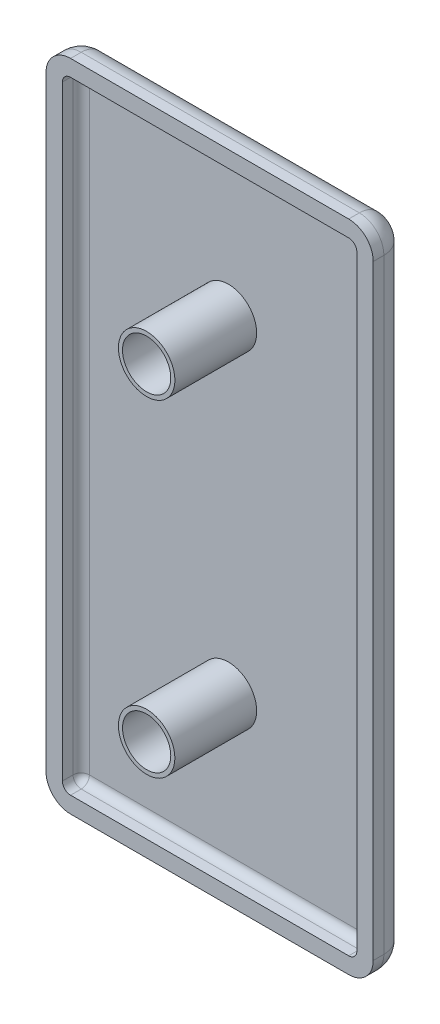
ISO-10303-21;
HEADER;
FILE_DESCRIPTION(('STEP AP214'),'2;1');
FILE_NAME('part.step','',(''),(''),'','','');
FILE_SCHEMA(('AUTOMOTIVE_DESIGN { 1 0 10303 214 1 1 1 1 }'));
ENDSEC;
DATA;
#1=APPLICATION_CONTEXT('core data for automotive mechanical design processes');
#2=APPLICATION_PROTOCOL_DEFINITION('international standard','automotive_design',2000,#1);
#3=PRODUCT_CONTEXT('',#1,'mechanical');
#4=PRODUCT('Part','Part','',(#3));
#5=PRODUCT_RELATED_PRODUCT_CATEGORY('part','',(#4));
#6=PRODUCT_DEFINITION_FORMATION('','',#4);
#7=PRODUCT_DEFINITION_CONTEXT('part definition',#1,'design');
#8=PRODUCT_DEFINITION('design','',#6,#7);
#9=PRODUCT_DEFINITION_SHAPE('','',#8);
#10=(LENGTH_UNIT() NAMED_UNIT(*) SI_UNIT(.MILLI.,.METRE.));
#11=(NAMED_UNIT(*) PLANE_ANGLE_UNIT() SI_UNIT($,.RADIAN.));
#12=(NAMED_UNIT(*) SI_UNIT($,.STERADIAN.) SOLID_ANGLE_UNIT());
#13=UNCERTAINTY_MEASURE_WITH_UNIT(LENGTH_MEASURE(1.E-05),#10,'distance_accuracy_value','');
#14=(GEOMETRIC_REPRESENTATION_CONTEXT(3) GLOBAL_UNCERTAINTY_ASSIGNED_CONTEXT((#13)) GLOBAL_UNIT_ASSIGNED_CONTEXT((#10,
#11,#12)) REPRESENTATION_CONTEXT('',''));
#15=CARTESIAN_POINT('',(0.,0.,0.));
#16=DIRECTION('',(0.,0.,1.));
#17=DIRECTION('',(1.,0.,0.));
#18=AXIS2_PLACEMENT_3D('',#15,#16,#17);
#19=CARTESIAN_POINT('',(3.,3.,2.));
#20=DIRECTION('',(0.,0.,1.));
#21=DIRECTION('',(1.,0.,0.));
#22=AXIS2_PLACEMENT_3D('',#19,#20,#21);
#23=PLANE('',#22);
#24=DIRECTION('',(1.,0.,0.));
#25=VECTOR('',#24,1.);
#26=CARTESIAN_POINT('',(3.,3.,2.));
#27=LINE('',#26,#25);
#28=CARTESIAN_POINT('',(37.,3.,2.));
#29=VERTEX_POINT('',#28);
#30=CARTESIAN_POINT('',(3.,3.,2.));
#31=VERTEX_POINT('',#30);
#32=EDGE_CURVE('E811',#29,#31,#27,.F.);
#33=ORIENTED_EDGE('',*,*,#32,.F.);
#34=DIRECTION('',(0.,1.,0.));
#35=VECTOR('',#34,1.);
#36=CARTESIAN_POINT('',(37.,3.,2.));
#37=LINE('',#36,#35);
#38=CARTESIAN_POINT('',(37.,77.,2.));
#39=VERTEX_POINT('',#38);
#40=EDGE_CURVE('E817',#39,#29,#37,.F.);
#41=ORIENTED_EDGE('',*,*,#40,.F.);
#42=DIRECTION('',(1.,0.,0.));
#43=VECTOR('',#42,1.);
#44=CARTESIAN_POINT('',(3.,77.,2.));
#45=LINE('',#44,#43);
#46=CARTESIAN_POINT('',(3.,77.,2.));
#47=VERTEX_POINT('',#46);
#48=EDGE_CURVE('E820',#47,#39,#45,.T.);
#49=ORIENTED_EDGE('',*,*,#48,.F.);
#50=DIRECTION('',(0.,1.,0.));
#51=VECTOR('',#50,1.);
#52=CARTESIAN_POINT('',(3.,3.,2.));
#53=LINE('',#52,#51);
#54=EDGE_CURVE('E808',#31,#47,#53,.T.);
#55=ORIENTED_EDGE('',*,*,#54,.F.);
#56=EDGE_LOOP('',(#33,#41,#49,#55));
#57=FACE_BOUND('',#56,.T.);
#58=CARTESIAN_POINT('',(20.,20.,2.));
#59=DIRECTION('',(0.,0.,1.));
#60=DIRECTION('',(1.,0.,0.));
#61=AXIS2_PLACEMENT_3D('',#58,#59,#60);
#62=CIRCLE('',#61,3.45);
#63=CARTESIAN_POINT('',(23.45,20.,2.));
#64=VERTEX_POINT('',#63);
#65=EDGE_CURVE('E835',#64,#64,#62,.T.);
#66=ORIENTED_EDGE('',*,*,#65,.F.);
#67=EDGE_LOOP('',(#66));
#68=FACE_BOUND('',#67,.T.);
#69=CARTESIAN_POINT('',(20.,60.,2.));
#70=DIRECTION('',(0.,0.,1.));
#71=DIRECTION('',(-1.,0.,0.));
#72=AXIS2_PLACEMENT_3D('',#69,#70,#71);
#73=CIRCLE('',#72,3.45);
#74=CARTESIAN_POINT('',(16.55,60.,2.));
#75=VERTEX_POINT('',#74);
#76=EDGE_CURVE('E844',#75,#75,#73,.T.);
#77=ORIENTED_EDGE('',*,*,#76,.F.);
#78=EDGE_LOOP('',(#77));
#79=FACE_BOUND('',#78,.T.);
#80=ADVANCED_FACE('F35',(#57,#68,#79),#23,.T.);
#81=CARTESIAN_POINT('',(3.,3.,4.3));
#82=DIRECTION('',(0.,0.,-1.));
#83=DIRECTION('',(-1.,0.,0.));
#84=AXIS2_PLACEMENT_3D('',#81,#82,#83);
#85=CYLINDRICAL_SURFACE('',#84,3.);
#86=DIRECTION('',(0.,0.,-1.));
#87=VECTOR('',#86,1.);
#88=CARTESIAN_POINT('',(0.,3.,4.3));
#89=LINE('',#88,#87);
#90=CARTESIAN_POINT('',(0.,3.,4.3));
#91=VERTEX_POINT('',#90);
#92=CARTESIAN_POINT('',(0.,3.,3.));
#93=VERTEX_POINT('',#92);
#94=EDGE_CURVE('E257',#91,#93,#89,.T.);
#95=ORIENTED_EDGE('',*,*,#94,.T.);
#96=CARTESIAN_POINT('',(3.,3.,3.));
#97=DIRECTION('',(0.,0.,-1.));
#98=DIRECTION('',(-1.,0.,0.));
#99=AXIS2_PLACEMENT_3D('',#96,#97,#98);
#100=CIRCLE('',#99,3.);
#101=CARTESIAN_POINT('',(3.,0.,3.));
#102=VERTEX_POINT('',#101);
#103=EDGE_CURVE('E279',#93,#102,#100,.F.);
#104=ORIENTED_EDGE('',*,*,#103,.T.);
#105=DIRECTION('',(0.,0.,-1.));
#106=VECTOR('',#105,1.);
#107=CARTESIAN_POINT('',(3.,0.,4.3));
#108=LINE('',#107,#106);
#109=CARTESIAN_POINT('',(3.,0.,4.3));
#110=VERTEX_POINT('',#109);
#111=EDGE_CURVE('E277',#110,#102,#108,.T.);
#112=ORIENTED_EDGE('',*,*,#111,.F.);
#113=CARTESIAN_POINT('',(3.,3.,4.3));
#114=DIRECTION('',(0.,0.,1.));
#115=DIRECTION('',(1.,0.,0.));
#116=AXIS2_PLACEMENT_3D('',#113,#114,#115);
#117=CIRCLE('',#116,3.);
#118=EDGE_CURVE('E239',#91,#110,#117,.T.);
#119=ORIENTED_EDGE('',*,*,#118,.F.);
#120=EDGE_LOOP('',(#95,#104,#112,#119));
#121=FACE_BOUND('',#120,.T.);
#122=ADVANCED_FACE('F346',(#121),#85,.T.);
#123=CARTESIAN_POINT('',(3.,0.,4.3));
#124=DIRECTION('',(0.,1.,0.));
#125=DIRECTION('',(0.,0.,1.));
#126=AXIS2_PLACEMENT_3D('',#123,#124,#125);
#127=PLANE('',#126);
#128=ORIENTED_EDGE('',*,*,#111,.T.);
#129=DIRECTION('',(1.,0.,0.));
#130=VECTOR('',#129,1.);
#131=CARTESIAN_POINT('',(3.,0.,3.));
#132=LINE('',#131,#130);
#133=CARTESIAN_POINT('',(37.,0.,3.));
#134=VERTEX_POINT('',#133);
#135=EDGE_CURVE('E58',#102,#134,#132,.T.);
#136=ORIENTED_EDGE('',*,*,#135,.T.);
#137=DIRECTION('',(0.,0.,-1.));
#138=VECTOR('',#137,1.);
#139=CARTESIAN_POINT('',(37.,0.,4.3));
#140=LINE('',#139,#138);
#141=CARTESIAN_POINT('',(37.,0.,4.3));
#142=VERTEX_POINT('',#141);
#143=EDGE_CURVE('E275',#142,#134,#140,.T.);
#144=ORIENTED_EDGE('',*,*,#143,.F.);
#145=DIRECTION('',(1.,0.,0.));
#146=VECTOR('',#145,1.);
#147=CARTESIAN_POINT('',(3.,0.,4.3));
#148=LINE('',#147,#146);
#149=EDGE_CURVE('E242',#110,#142,#148,.T.);
#150=ORIENTED_EDGE('',*,*,#149,.F.);
#151=EDGE_LOOP('',(#128,#136,#144,#150));
#152=FACE_BOUND('',#151,.T.);
#153=ADVANCED_FACE('F462',(#152),#127,.F.);
#154=CARTESIAN_POINT('',(37.,3.,4.3));
#155=DIRECTION('',(0.,0.,-1.));
#156=DIRECTION('',(-1.,0.,0.));
#157=AXIS2_PLACEMENT_3D('',#154,#155,#156);
#158=CYLINDRICAL_SURFACE('',#157,3.);
#159=ORIENTED_EDGE('',*,*,#143,.T.);
#160=CARTESIAN_POINT('',(37.,3.,3.));
#161=DIRECTION('',(0.,0.,-1.));
#162=DIRECTION('',(-1.,0.,0.));
#163=AXIS2_PLACEMENT_3D('',#160,#161,#162);
#164=CIRCLE('',#163,3.);
#165=CARTESIAN_POINT('',(40.,3.,3.));
#166=VERTEX_POINT('',#165);
#167=EDGE_CURVE('E301',#134,#166,#164,.F.);
#168=ORIENTED_EDGE('',*,*,#167,.T.);
#169=DIRECTION('',(0.,0.,-1.));
#170=VECTOR('',#169,1.);
#171=CARTESIAN_POINT('',(40.,3.,4.3));
#172=LINE('',#171,#170);
#173=CARTESIAN_POINT('',(40.,3.,4.3));
#174=VERTEX_POINT('',#173);
#175=EDGE_CURVE('E272',#174,#166,#172,.T.);
#176=ORIENTED_EDGE('',*,*,#175,.F.);
#177=CARTESIAN_POINT('',(37.,3.,4.3));
#178=DIRECTION('',(0.,0.,1.));
#179=DIRECTION('',(1.,0.,0.));
#180=AXIS2_PLACEMENT_3D('',#177,#178,#179);
#181=CIRCLE('',#180,3.);
#182=EDGE_CURVE('E245',#142,#174,#181,.T.);
#183=ORIENTED_EDGE('',*,*,#182,.F.);
#184=EDGE_LOOP('',(#159,#168,#176,#183));
#185=FACE_BOUND('',#184,.T.);
#186=ADVANCED_FACE('F458',(#185),#158,.T.);
#187=CARTESIAN_POINT('',(40.,3.,4.3));
#188=DIRECTION('',(-1.,0.,0.));
#189=DIRECTION('',(0.,0.,1.));
#190=AXIS2_PLACEMENT_3D('',#187,#188,#189);
#191=PLANE('',#190);
#192=ORIENTED_EDGE('',*,*,#175,.T.);
#193=DIRECTION('',(0.,1.,0.));
#194=VECTOR('',#193,1.);
#195=CARTESIAN_POINT('',(40.,3.,3.));
#196=LINE('',#195,#194);
#197=CARTESIAN_POINT('',(40.,77.,3.));
#198=VERTEX_POINT('',#197);
#199=EDGE_CURVE('E299',#166,#198,#196,.T.);
#200=ORIENTED_EDGE('',*,*,#199,.T.);
#201=DIRECTION('',(0.,0.,-1.));
#202=VECTOR('',#201,1.);
#203=CARTESIAN_POINT('',(40.,77.,4.3));
#204=LINE('',#203,#202);
#205=CARTESIAN_POINT('',(40.,77.,4.3));
#206=VERTEX_POINT('',#205);
#207=EDGE_CURVE('E269',#206,#198,#204,.T.);
#208=ORIENTED_EDGE('',*,*,#207,.F.);
#209=DIRECTION('',(0.,1.,0.));
#210=VECTOR('',#209,1.);
#211=CARTESIAN_POINT('',(40.,3.,4.3));
#212=LINE('',#211,#210);
#213=EDGE_CURVE('E247',#174,#206,#212,.T.);
#214=ORIENTED_EDGE('',*,*,#213,.F.);
#215=EDGE_LOOP('',(#192,#200,#208,#214));
#216=FACE_BOUND('',#215,.T.);
#217=ADVANCED_FACE('F454',(#216),#191,.F.);
#218=CARTESIAN_POINT('',(37.,77.,4.3));
#219=DIRECTION('',(0.,0.,-1.));
#220=DIRECTION('',(-1.,0.,0.));
#221=AXIS2_PLACEMENT_3D('',#218,#219,#220);
#222=CYLINDRICAL_SURFACE('',#221,3.);
#223=ORIENTED_EDGE('',*,*,#207,.T.);
#224=CARTESIAN_POINT('',(37.,77.,3.));
#225=DIRECTION('',(0.,0.,-1.));
#226=DIRECTION('',(-1.,0.,0.));
#227=AXIS2_PLACEMENT_3D('',#224,#225,#226);
#228=CIRCLE('',#227,3.);
#229=CARTESIAN_POINT('',(37.,80.,3.));
#230=VERTEX_POINT('',#229);
#231=EDGE_CURVE('E297',#198,#230,#228,.F.);
#232=ORIENTED_EDGE('',*,*,#231,.T.);
#233=DIRECTION('',(0.,0.,-1.));
#234=VECTOR('',#233,1.);
#235=CARTESIAN_POINT('',(37.,80.,4.3));
#236=LINE('',#235,#234);
#237=CARTESIAN_POINT('',(37.,80.,4.3));
#238=VERTEX_POINT('',#237);
#239=EDGE_CURVE('E266',#238,#230,#236,.T.);
#240=ORIENTED_EDGE('',*,*,#239,.F.);
#241=CARTESIAN_POINT('',(37.,77.,4.3));
#242=DIRECTION('',(0.,0.,1.));
#243=DIRECTION('',(1.,0.,0.));
#244=AXIS2_PLACEMENT_3D('',#241,#242,#243);
#245=CIRCLE('',#244,3.);
#246=EDGE_CURVE('E249',#206,#238,#245,.T.);
#247=ORIENTED_EDGE('',*,*,#246,.F.);
#248=EDGE_LOOP('',(#223,#232,#240,#247));
#249=FACE_BOUND('',#248,.T.);
#250=ADVANCED_FACE('F450',(#249),#222,.T.);
#251=CARTESIAN_POINT('',(37.,80.,4.3));
#252=DIRECTION('',(0.,-1.,0.));
#253=DIRECTION('',(0.,0.,-1.));
#254=AXIS2_PLACEMENT_3D('',#251,#252,#253);
#255=PLANE('',#254);
#256=ORIENTED_EDGE('',*,*,#239,.T.);
#257=DIRECTION('',(-1.,0.,0.));
#258=VECTOR('',#257,1.);
#259=CARTESIAN_POINT('',(37.,80.,3.));
#260=LINE('',#259,#258);
#261=CARTESIAN_POINT('',(3.,80.,3.));
#262=VERTEX_POINT('',#261);
#263=EDGE_CURVE('E295',#230,#262,#260,.T.);
#264=ORIENTED_EDGE('',*,*,#263,.T.);
#265=DIRECTION('',(0.,0.,-1.));
#266=VECTOR('',#265,1.);
#267=CARTESIAN_POINT('',(3.,80.,4.3));
#268=LINE('',#267,#266);
#269=CARTESIAN_POINT('',(3.,80.,4.3));
#270=VERTEX_POINT('',#269);
#271=EDGE_CURVE('E263',#270,#262,#268,.T.);
#272=ORIENTED_EDGE('',*,*,#271,.F.);
#273=DIRECTION('',(-1.,0.,0.));
#274=VECTOR('',#273,1.);
#275=CARTESIAN_POINT('',(37.,80.,4.3));
#276=LINE('',#275,#274);
#277=EDGE_CURVE('E251',#238,#270,#276,.T.);
#278=ORIENTED_EDGE('',*,*,#277,.F.);
#279=EDGE_LOOP('',(#256,#264,#272,#278));
#280=FACE_BOUND('',#279,.T.);
#281=ADVANCED_FACE('F446',(#280),#255,.F.);
#282=CARTESIAN_POINT('',(3.,77.,4.3));
#283=DIRECTION('',(0.,0.,-1.));
#284=DIRECTION('',(-1.,0.,0.));
#285=AXIS2_PLACEMENT_3D('',#282,#283,#284);
#286=CYLINDRICAL_SURFACE('',#285,3.);
#287=ORIENTED_EDGE('',*,*,#271,.T.);
#288=CARTESIAN_POINT('',(3.,77.,3.));
#289=DIRECTION('',(0.,0.,-1.));
#290=DIRECTION('',(-1.,0.,0.));
#291=AXIS2_PLACEMENT_3D('',#288,#289,#290);
#292=CIRCLE('',#291,3.);
#293=CARTESIAN_POINT('',(0.,77.,3.));
#294=VERTEX_POINT('',#293);
#295=EDGE_CURVE('E293',#262,#294,#292,.F.);
#296=ORIENTED_EDGE('',*,*,#295,.T.);
#297=DIRECTION('',(0.,0.,-1.));
#298=VECTOR('',#297,1.);
#299=CARTESIAN_POINT('',(0.,77.,4.3));
#300=LINE('',#299,#298);
#301=CARTESIAN_POINT('',(0.,77.,4.3));
#302=VERTEX_POINT('',#301);
#303=EDGE_CURVE('E260',#302,#294,#300,.T.);
#304=ORIENTED_EDGE('',*,*,#303,.F.);
#305=CARTESIAN_POINT('',(3.,77.,4.3));
#306=DIRECTION('',(0.,0.,1.));
#307=DIRECTION('',(1.,0.,0.));
#308=AXIS2_PLACEMENT_3D('',#305,#306,#307);
#309=CIRCLE('',#308,3.);
#310=EDGE_CURVE('E253',#270,#302,#309,.T.);
#311=ORIENTED_EDGE('',*,*,#310,.F.);
#312=EDGE_LOOP('',(#287,#296,#304,#311));
#313=FACE_BOUND('',#312,.T.);
#314=ADVANCED_FACE('F442',(#313),#286,.T.);
#315=CARTESIAN_POINT('',(0.,77.,4.3));
#316=DIRECTION('',(1.,0.,0.));
#317=DIRECTION('',(0.,0.,-1.));
#318=AXIS2_PLACEMENT_3D('',#315,#316,#317);
#319=PLANE('',#318);
#320=ORIENTED_EDGE('',*,*,#303,.T.);
#321=DIRECTION('',(0.,-1.,0.));
#322=VECTOR('',#321,1.);
#323=CARTESIAN_POINT('',(0.,77.,3.));
#324=LINE('',#323,#322);
#325=EDGE_CURVE('E282',#294,#93,#324,.T.);
#326=ORIENTED_EDGE('',*,*,#325,.T.);
#327=ORIENTED_EDGE('',*,*,#94,.F.);
#328=DIRECTION('',(0.,-1.,0.));
#329=VECTOR('',#328,1.);
#330=CARTESIAN_POINT('',(0.,77.,4.3));
#331=LINE('',#330,#329);
#332=EDGE_CURVE('E255',#302,#91,#331,.T.);
#333=ORIENTED_EDGE('',*,*,#332,.F.);
#334=EDGE_LOOP('',(#320,#326,#327,#333));
#335=FACE_BOUND('',#334,.T.);
#336=ADVANCED_FACE('F435',(#335),#319,.F.);
#337=CARTESIAN_POINT('',(3.,3.,4.3));
#338=DIRECTION('',(0.,0.,1.));
#339=DIRECTION('',(1.,0.,0.));
#340=AXIS2_PLACEMENT_3D('',#337,#338,#339);
#341=PLANE('',#340);
#342=CARTESIAN_POINT('',(3.,3.,4.3));
#343=DIRECTION('',(0.,0.,1.));
#344=DIRECTION('',(1.,0.,0.));
#345=AXIS2_PLACEMENT_3D('',#342,#343,#344);
#346=CIRCLE('',#345,1.);
#347=CARTESIAN_POINT('',(2.,3.00000000000003,4.3));
#348=VERTEX_POINT('',#347);
#349=CARTESIAN_POINT('',(3.,2.,4.3));
#350=VERTEX_POINT('',#349);
#351=EDGE_CURVE('E222',#348,#350,#346,.T.);
#352=ORIENTED_EDGE('',*,*,#351,.F.);
#353=DIRECTION('',(0.,-1.,0.));
#354=VECTOR('',#353,1.);
#355=CARTESIAN_POINT('',(2.,77.,4.3));
#356=LINE('',#355,#354);
#357=CARTESIAN_POINT('',(2.,77.,4.3));
#358=VERTEX_POINT('',#357);
#359=EDGE_CURVE('E236',#358,#348,#356,.T.);
#360=ORIENTED_EDGE('',*,*,#359,.F.);
#361=CARTESIAN_POINT('',(3.,77.,4.3));
#362=DIRECTION('',(0.,0.,1.));
#363=DIRECTION('',(1.,0.,0.));
#364=AXIS2_PLACEMENT_3D('',#361,#362,#363);
#365=CIRCLE('',#364,1.);
#366=CARTESIAN_POINT('',(3.00000000000002,78.,4.3));
#367=VERTEX_POINT('',#366);
#368=EDGE_CURVE('E234',#367,#358,#365,.T.);
#369=ORIENTED_EDGE('',*,*,#368,.F.);
#370=DIRECTION('',(-1.,0.,0.));
#371=VECTOR('',#370,1.);
#372=CARTESIAN_POINT('',(37.,78.,4.3));
#373=LINE('',#372,#371);
#374=CARTESIAN_POINT('',(37.,78.,4.3));
#375=VERTEX_POINT('',#374);
#376=EDGE_CURVE('E232',#375,#367,#373,.T.);
#377=ORIENTED_EDGE('',*,*,#376,.F.);
#378=CARTESIAN_POINT('',(37.,77.,4.3));
#379=DIRECTION('',(0.,0.,1.));
#380=DIRECTION('',(1.,0.,0.));
#381=AXIS2_PLACEMENT_3D('',#378,#379,#380);
#382=CIRCLE('',#381,0.999999999999999);
#383=CARTESIAN_POINT('',(38.,77.,4.3));
#384=VERTEX_POINT('',#383);
#385=EDGE_CURVE('E230',#384,#375,#382,.T.);
#386=ORIENTED_EDGE('',*,*,#385,.F.);
#387=DIRECTION('',(0.,1.,0.));
#388=VECTOR('',#387,1.);
#389=CARTESIAN_POINT('',(38.,3.,4.3));
#390=LINE('',#389,#388);
#391=CARTESIAN_POINT('',(38.,3.,4.3));
#392=VERTEX_POINT('',#391);
#393=EDGE_CURVE('E228',#392,#384,#390,.T.);
#394=ORIENTED_EDGE('',*,*,#393,.F.);
#395=CARTESIAN_POINT('',(37.,3.,4.3));
#396=DIRECTION('',(0.,0.,1.));
#397=DIRECTION('',(1.,0.,0.));
#398=AXIS2_PLACEMENT_3D('',#395,#396,#397);
#399=CIRCLE('',#398,0.999999999999997);
#400=CARTESIAN_POINT('',(37.,2.,4.3));
#401=VERTEX_POINT('',#400);
#402=EDGE_CURVE('E226',#401,#392,#399,.T.);
#403=ORIENTED_EDGE('',*,*,#402,.F.);
#404=DIRECTION('',(1.,0.,0.));
#405=VECTOR('',#404,1.);
#406=CARTESIAN_POINT('',(3.,2.,4.3));
#407=LINE('',#406,#405);
#408=EDGE_CURVE('E194',#350,#401,#407,.T.);
#409=ORIENTED_EDGE('',*,*,#408,.F.);
#410=EDGE_LOOP('',(#352,#360,#369,#377,#386,#394,#403,#409));
#411=FACE_BOUND('',#410,.T.);
#412=ORIENTED_EDGE('',*,*,#118,.T.);
#413=ORIENTED_EDGE('',*,*,#149,.T.);
#414=ORIENTED_EDGE('',*,*,#182,.T.);
#415=ORIENTED_EDGE('',*,*,#213,.T.);
#416=ORIENTED_EDGE('',*,*,#246,.T.);
#417=ORIENTED_EDGE('',*,*,#277,.T.);
#418=ORIENTED_EDGE('',*,*,#310,.T.);
#419=ORIENTED_EDGE('',*,*,#332,.T.);
#420=EDGE_LOOP('',(#412,#413,#414,#415,#416,#417,#418,#419));
#421=FACE_BOUND('',#420,.T.);
#422=ADVANCED_FACE('F431',(#411,#421),#341,.T.);
#423=CARTESIAN_POINT('',(3.,3.,0.));
#424=DIRECTION('',(0.,0.,1.));
#425=DIRECTION('',(1.,0.,0.));
#426=AXIS2_PLACEMENT_3D('',#423,#424,#425);
#427=PLANE('',#426);
#428=DIRECTION('',(1.,0.,0.));
#429=VECTOR('',#428,1.);
#430=CARTESIAN_POINT('',(3.,3.,0.));
#431=LINE('',#430,#429);
#432=CARTESIAN_POINT('',(37.,3.,0.));
#433=VERTEX_POINT('',#432);
#434=CARTESIAN_POINT('',(3.,3.,0.));
#435=VERTEX_POINT('',#434);
#436=EDGE_CURVE('E284',#433,#435,#431,.F.);
#437=ORIENTED_EDGE('',*,*,#436,.T.);
#438=DIRECTION('',(0.,-1.,0.));
#439=VECTOR('',#438,1.);
#440=CARTESIAN_POINT('',(3.,3.,0.));
#441=LINE('',#440,#439);
#442=CARTESIAN_POINT('',(3.,77.,0.));
#443=VERTEX_POINT('',#442);
#444=EDGE_CURVE('E290',#435,#443,#441,.F.);
#445=ORIENTED_EDGE('',*,*,#444,.T.);
#446=DIRECTION('',(-1.,0.,0.));
#447=VECTOR('',#446,1.);
#448=CARTESIAN_POINT('',(3.,77.,0.));
#449=LINE('',#448,#447);
#450=CARTESIAN_POINT('',(37.,77.,0.));
#451=VERTEX_POINT('',#450);
#452=EDGE_CURVE('E288',#443,#451,#449,.F.);
#453=ORIENTED_EDGE('',*,*,#452,.T.);
#454=DIRECTION('',(0.,1.,0.));
#455=VECTOR('',#454,1.);
#456=CARTESIAN_POINT('',(37.,3.,0.));
#457=LINE('',#456,#455);
#458=EDGE_CURVE('E286',#451,#433,#457,.F.);
#459=ORIENTED_EDGE('',*,*,#458,.T.);
#460=EDGE_LOOP('',(#437,#445,#453,#459));
#461=FACE_BOUND('',#460,.T.);
#462=ADVANCED_FACE('F434',(#461),#427,.F.);
#463=CARTESIAN_POINT('',(37.,77.,3.));
#464=DIRECTION('',(0.,0.,1.));
#465=DIRECTION('',(1.,0.,0.));
#466=AXIS2_PLACEMENT_3D('',#463,#464,#465);
#467=SPHERICAL_SURFACE('',#466,3.);
#468=CARTESIAN_POINT('',(37.,77.,3.));
#469=DIRECTION('',(0.,-1.,0.));
#470=DIRECTION('',(0.,0.,-1.));
#471=AXIS2_PLACEMENT_3D('',#468,#469,#470);
#472=CIRCLE('',#471,3.);
#473=EDGE_CURVE('E319',#451,#198,#472,.T.);
#474=ORIENTED_EDGE('',*,*,#473,.F.);
#475=CARTESIAN_POINT('',(37.,77.,3.));
#476=DIRECTION('',(-1.,0.,0.));
#477=DIRECTION('',(0.,0.,1.));
#478=AXIS2_PLACEMENT_3D('',#475,#476,#477);
#479=CIRCLE('',#478,3.);
#480=EDGE_CURVE('E243',#230,#451,#479,.T.);
#481=ORIENTED_EDGE('',*,*,#480,.F.);
#482=ORIENTED_EDGE('',*,*,#231,.F.);
#483=EDGE_LOOP('',(#474,#481,#482));
#484=FACE_BOUND('',#483,.T.);
#485=ADVANCED_FACE('F37',(#484),#467,.T.);
#486=CARTESIAN_POINT('',(37.,77.,3.));
#487=DIRECTION('',(-1.,0.,0.));
#488=DIRECTION('',(0.,0.,1.));
#489=AXIS2_PLACEMENT_3D('',#486,#487,#488);
#490=CYLINDRICAL_SURFACE('',#489,3.);
#491=ORIENTED_EDGE('',*,*,#480,.T.);
#492=ORIENTED_EDGE('',*,*,#452,.F.);
#493=CARTESIAN_POINT('',(3.,77.,3.));
#494=DIRECTION('',(-1.,0.,0.));
#495=DIRECTION('',(0.,0.,1.));
#496=AXIS2_PLACEMENT_3D('',#493,#494,#495);
#497=CIRCLE('',#496,3.);
#498=EDGE_CURVE('E316',#262,#443,#497,.T.);
#499=ORIENTED_EDGE('',*,*,#498,.F.);
#500=ORIENTED_EDGE('',*,*,#263,.F.);
#501=EDGE_LOOP('',(#491,#492,#499,#500));
#502=FACE_BOUND('',#501,.T.);
#503=ADVANCED_FACE('F490',(#502),#490,.T.);
#504=CARTESIAN_POINT('',(37.,3.,3.));
#505=DIRECTION('',(0.,1.,0.));
#506=DIRECTION('',(0.,0.,1.));
#507=AXIS2_PLACEMENT_3D('',#504,#505,#506);
#508=CYLINDRICAL_SURFACE('',#507,3.);
#509=ORIENTED_EDGE('',*,*,#473,.T.);
#510=ORIENTED_EDGE('',*,*,#199,.F.);
#511=CARTESIAN_POINT('',(37.,3.,3.));
#512=DIRECTION('',(0.,-1.,0.));
#513=DIRECTION('',(0.,0.,-1.));
#514=AXIS2_PLACEMENT_3D('',#511,#512,#513);
#515=CIRCLE('',#514,3.);
#516=EDGE_CURVE('E313',#433,#166,#515,.T.);
#517=ORIENTED_EDGE('',*,*,#516,.F.);
#518=ORIENTED_EDGE('',*,*,#458,.F.);
#519=EDGE_LOOP('',(#509,#510,#517,#518));
#520=FACE_BOUND('',#519,.T.);
#521=ADVANCED_FACE('F487',(#520),#508,.T.);
#522=CARTESIAN_POINT('',(3.,77.,3.));
#523=DIRECTION('',(0.,0.,1.));
#524=DIRECTION('',(1.,0.,0.));
#525=AXIS2_PLACEMENT_3D('',#522,#523,#524);
#526=SPHERICAL_SURFACE('',#525,3.);
#527=ORIENTED_EDGE('',*,*,#295,.F.);
#528=ORIENTED_EDGE('',*,*,#498,.T.);
#529=CARTESIAN_POINT('',(3.,77.,3.));
#530=DIRECTION('',(0.,-1.,0.));
#531=DIRECTION('',(0.,0.,-1.));
#532=AXIS2_PLACEMENT_3D('',#529,#530,#531);
#533=CIRCLE('',#532,3.);
#534=EDGE_CURVE('E311',#294,#443,#533,.T.);
#535=ORIENTED_EDGE('',*,*,#534,.F.);
#536=EDGE_LOOP('',(#527,#528,#535));
#537=FACE_BOUND('',#536,.T.);
#538=ADVANCED_FACE('F483',(#537),#526,.T.);
#539=CARTESIAN_POINT('',(37.,3.,3.));
#540=DIRECTION('',(0.,0.,1.));
#541=DIRECTION('',(1.,0.,0.));
#542=AXIS2_PLACEMENT_3D('',#539,#540,#541);
#543=SPHERICAL_SURFACE('',#542,3.);
#544=ORIENTED_EDGE('',*,*,#516,.T.);
#545=ORIENTED_EDGE('',*,*,#167,.F.);
#546=CARTESIAN_POINT('',(37.,3.,3.));
#547=DIRECTION('',(-1.,0.,0.));
#548=DIRECTION('',(0.,0.,1.));
#549=AXIS2_PLACEMENT_3D('',#546,#547,#548);
#550=CIRCLE('',#549,3.);
#551=EDGE_CURVE('E308',#433,#134,#550,.T.);
#552=ORIENTED_EDGE('',*,*,#551,.F.);
#553=EDGE_LOOP('',(#544,#545,#552));
#554=FACE_BOUND('',#553,.T.);
#555=ADVANCED_FACE('F479',(#554),#543,.T.);
#556=CARTESIAN_POINT('',(3.,77.,3.));
#557=DIRECTION('',(0.,-1.,0.));
#558=DIRECTION('',(0.,0.,-1.));
#559=AXIS2_PLACEMENT_3D('',#556,#557,#558);
#560=CYLINDRICAL_SURFACE('',#559,3.);
#561=ORIENTED_EDGE('',*,*,#534,.T.);
#562=ORIENTED_EDGE('',*,*,#444,.F.);
#563=CARTESIAN_POINT('',(3.,3.,3.));
#564=DIRECTION('',(0.,-1.,0.));
#565=DIRECTION('',(0.,0.,-1.));
#566=AXIS2_PLACEMENT_3D('',#563,#564,#565);
#567=CIRCLE('',#566,3.);
#568=EDGE_CURVE('E305',#93,#435,#567,.T.);
#569=ORIENTED_EDGE('',*,*,#568,.F.);
#570=ORIENTED_EDGE('',*,*,#325,.F.);
#571=EDGE_LOOP('',(#561,#562,#569,#570));
#572=FACE_BOUND('',#571,.T.);
#573=ADVANCED_FACE('F475',(#572),#560,.T.);
#574=CARTESIAN_POINT('',(3.,3.,3.));
#575=DIRECTION('',(1.,0.,0.));
#576=DIRECTION('',(0.,0.,-1.));
#577=AXIS2_PLACEMENT_3D('',#574,#575,#576);
#578=CYLINDRICAL_SURFACE('',#577,3.);
#579=ORIENTED_EDGE('',*,*,#551,.T.);
#580=ORIENTED_EDGE('',*,*,#135,.F.);
#581=CARTESIAN_POINT('',(3.,3.,3.));
#582=DIRECTION('',(-1.,0.,0.));
#583=DIRECTION('',(0.,0.,1.));
#584=AXIS2_PLACEMENT_3D('',#581,#582,#583);
#585=CIRCLE('',#584,3.);
#586=EDGE_CURVE('E186',#435,#102,#585,.T.);
#587=ORIENTED_EDGE('',*,*,#586,.F.);
#588=ORIENTED_EDGE('',*,*,#436,.F.);
#589=EDGE_LOOP('',(#579,#580,#587,#588));
#590=FACE_BOUND('',#589,.T.);
#591=ADVANCED_FACE('F471',(#590),#578,.T.);
#592=CARTESIAN_POINT('',(3.,3.,3.));
#593=DIRECTION('',(0.,0.,1.));
#594=DIRECTION('',(1.,0.,0.));
#595=AXIS2_PLACEMENT_3D('',#592,#593,#594);
#596=SPHERICAL_SURFACE('',#595,3.);
#597=ORIENTED_EDGE('',*,*,#103,.F.);
#598=ORIENTED_EDGE('',*,*,#568,.T.);
#599=ORIENTED_EDGE('',*,*,#586,.T.);
#600=EDGE_LOOP('',(#597,#598,#599));
#601=FACE_BOUND('',#600,.T.);
#602=ADVANCED_FACE('F376',(#601),#596,.T.);
#603=CARTESIAN_POINT('',(3.,3.,4.3));
#604=DIRECTION('',(0.,0.,-1.));
#605=DIRECTION('',(-1.,0.,0.));
#606=AXIS2_PLACEMENT_3D('',#603,#604,#605);
#607=CYLINDRICAL_SURFACE('',#606,1.);
#608=DIRECTION('',(0.,0.,-1.));
#609=VECTOR('',#608,1.);
#610=CARTESIAN_POINT('',(2.,3.,4.3));
#611=LINE('',#610,#609);
#612=CARTESIAN_POINT('',(2.,3.00000000000003,3.));
#613=VERTEX_POINT('',#612);
#614=EDGE_CURVE('E238',#348,#613,#611,.T.);
#615=ORIENTED_EDGE('',*,*,#614,.F.);
#616=ORIENTED_EDGE('',*,*,#351,.T.);
#617=DIRECTION('',(0.,0.,1.));
#618=VECTOR('',#617,1.);
#619=CARTESIAN_POINT('',(3.,2.,4.3));
#620=LINE('',#619,#618);
#621=CARTESIAN_POINT('',(3.,2.,3.));
#622=VERTEX_POINT('',#621);
#623=EDGE_CURVE('E197',#350,#622,#620,.F.);
#624=ORIENTED_EDGE('',*,*,#623,.T.);
#625=CARTESIAN_POINT('',(3.,3.,3.));
#626=DIRECTION('',(0.,0.,-1.));
#627=DIRECTION('',(-1.,0.,0.));
#628=AXIS2_PLACEMENT_3D('',#625,#626,#627);
#629=CIRCLE('',#628,1.);
#630=EDGE_CURVE('E785',#613,#622,#629,.F.);
#631=ORIENTED_EDGE('',*,*,#630,.F.);
#632=EDGE_LOOP('',(#615,#616,#624,#631));
#633=FACE_BOUND('',#632,.T.);
#634=ADVANCED_FACE('F373',(#633),#607,.F.);
#635=CARTESIAN_POINT('',(3.,2.,4.3));
#636=DIRECTION('',(0.,1.,0.));
#637=DIRECTION('',(0.,0.,1.));
#638=AXIS2_PLACEMENT_3D('',#635,#636,#637);
#639=PLANE('',#638);
#640=ORIENTED_EDGE('',*,*,#623,.F.);
#641=ORIENTED_EDGE('',*,*,#408,.T.);
#642=DIRECTION('',(0.,0.,-1.));
#643=VECTOR('',#642,1.);
#644=CARTESIAN_POINT('',(37.,2.,4.3));
#645=LINE('',#644,#643);
#646=CARTESIAN_POINT('',(37.,2.,3.));
#647=VERTEX_POINT('',#646);
#648=EDGE_CURVE('E190',#401,#647,#645,.T.);
#649=ORIENTED_EDGE('',*,*,#648,.T.);
#650=DIRECTION('',(1.,0.,0.));
#651=VECTOR('',#650,1.);
#652=CARTESIAN_POINT('',(3.,2.,3.));
#653=LINE('',#652,#651);
#654=EDGE_CURVE('E175',#622,#647,#653,.T.);
#655=ORIENTED_EDGE('',*,*,#654,.F.);
#656=EDGE_LOOP('',(#640,#641,#649,#655));
#657=FACE_BOUND('',#656,.T.);
#658=ADVANCED_FACE('F192',(#657),#639,.T.);
#659=CARTESIAN_POINT('',(37.,3.,4.3));
#660=DIRECTION('',(0.,0.,-1.));
#661=DIRECTION('',(-1.,0.,0.));
#662=AXIS2_PLACEMENT_3D('',#659,#660,#661);
#663=CYLINDRICAL_SURFACE('',#662,0.999999999999997);
#664=ORIENTED_EDGE('',*,*,#648,.F.);
#665=ORIENTED_EDGE('',*,*,#402,.T.);
#666=DIRECTION('',(0.,0.,1.));
#667=VECTOR('',#666,1.);
#668=CARTESIAN_POINT('',(38.,3.,4.3));
#669=LINE('',#668,#667);
#670=CARTESIAN_POINT('',(38.,3.,3.));
#671=VERTEX_POINT('',#670);
#672=EDGE_CURVE('E198',#392,#671,#669,.F.);
#673=ORIENTED_EDGE('',*,*,#672,.T.);
#674=CARTESIAN_POINT('',(37.,3.,3.));
#675=DIRECTION('',(0.,0.,-1.));
#676=DIRECTION('',(-1.,0.,0.));
#677=AXIS2_PLACEMENT_3D('',#674,#675,#676);
#678=CIRCLE('',#677,0.999999999999997);
#679=EDGE_CURVE('E187',#647,#671,#678,.F.);
#680=ORIENTED_EDGE('',*,*,#679,.F.);
#681=EDGE_LOOP('',(#664,#665,#673,#680));
#682=FACE_BOUND('',#681,.T.);
#683=ADVANCED_FACE('F201',(#682),#663,.F.);
#684=CARTESIAN_POINT('',(38.,3.,4.3));
#685=DIRECTION('',(-1.,0.,0.));
#686=DIRECTION('',(0.,0.,1.));
#687=AXIS2_PLACEMENT_3D('',#684,#685,#686);
#688=PLANE('',#687);
#689=ORIENTED_EDGE('',*,*,#672,.F.);
#690=ORIENTED_EDGE('',*,*,#393,.T.);
#691=DIRECTION('',(0.,0.,-1.));
#692=VECTOR('',#691,1.);
#693=CARTESIAN_POINT('',(38.,77.,4.3));
#694=LINE('',#693,#692);
#695=CARTESIAN_POINT('',(38.,77.,3.));
#696=VERTEX_POINT('',#695);
#697=EDGE_CURVE('E792',#384,#696,#694,.T.);
#698=ORIENTED_EDGE('',*,*,#697,.T.);
#699=DIRECTION('',(0.,1.,0.));
#700=VECTOR('',#699,1.);
#701=CARTESIAN_POINT('',(38.,3.,3.));
#702=LINE('',#701,#700);
#703=EDGE_CURVE('E206',#671,#696,#702,.T.);
#704=ORIENTED_EDGE('',*,*,#703,.F.);
#705=EDGE_LOOP('',(#689,#690,#698,#704));
#706=FACE_BOUND('',#705,.T.);
#707=ADVANCED_FACE('F382',(#706),#688,.T.);
#708=CARTESIAN_POINT('',(37.,77.,4.3));
#709=DIRECTION('',(0.,0.,-1.));
#710=DIRECTION('',(-1.,0.,0.));
#711=AXIS2_PLACEMENT_3D('',#708,#709,#710);
#712=CYLINDRICAL_SURFACE('',#711,0.999999999999999);
#713=ORIENTED_EDGE('',*,*,#697,.F.);
#714=ORIENTED_EDGE('',*,*,#385,.T.);
#715=DIRECTION('',(0.,0.,-1.));
#716=VECTOR('',#715,1.);
#717=CARTESIAN_POINT('',(37.,78.,4.3));
#718=LINE('',#717,#716);
#719=CARTESIAN_POINT('',(37.,78.,3.));
#720=VERTEX_POINT('',#719);
#721=EDGE_CURVE('E797',#375,#720,#718,.T.);
#722=ORIENTED_EDGE('',*,*,#721,.T.);
#723=CARTESIAN_POINT('',(37.,77.,3.));
#724=DIRECTION('',(0.,0.,-1.));
#725=DIRECTION('',(-1.,0.,0.));
#726=AXIS2_PLACEMENT_3D('',#723,#724,#725);
#727=CIRCLE('',#726,0.999999999999999);
#728=EDGE_CURVE('E794',#696,#720,#727,.F.);
#729=ORIENTED_EDGE('',*,*,#728,.F.);
#730=EDGE_LOOP('',(#713,#714,#722,#729));
#731=FACE_BOUND('',#730,.T.);
#732=ADVANCED_FACE('F385',(#731),#712,.F.);
#733=CARTESIAN_POINT('',(37.,78.,4.3));
#734=DIRECTION('',(0.,-1.,0.));
#735=DIRECTION('',(0.,0.,-1.));
#736=AXIS2_PLACEMENT_3D('',#733,#734,#735);
#737=PLANE('',#736);
#738=ORIENTED_EDGE('',*,*,#721,.F.);
#739=ORIENTED_EDGE('',*,*,#376,.T.);
#740=DIRECTION('',(0.,0.,-1.));
#741=VECTOR('',#740,1.);
#742=CARTESIAN_POINT('',(3.,78.,4.3));
#743=LINE('',#742,#741);
#744=CARTESIAN_POINT('',(3.00000000000002,78.,3.));
#745=VERTEX_POINT('',#744);
#746=EDGE_CURVE('E802',#367,#745,#743,.T.);
#747=ORIENTED_EDGE('',*,*,#746,.T.);
#748=DIRECTION('',(1.,0.,0.));
#749=VECTOR('',#748,1.);
#750=CARTESIAN_POINT('',(37.,78.,3.));
#751=LINE('',#750,#749);
#752=EDGE_CURVE('E799',#720,#745,#751,.F.);
#753=ORIENTED_EDGE('',*,*,#752,.F.);
#754=EDGE_LOOP('',(#738,#739,#747,#753));
#755=FACE_BOUND('',#754,.T.);
#756=ADVANCED_FACE('F389',(#755),#737,.T.);
#757=CARTESIAN_POINT('',(3.,77.,4.3));
#758=DIRECTION('',(0.,0.,-1.));
#759=DIRECTION('',(-1.,0.,0.));
#760=AXIS2_PLACEMENT_3D('',#757,#758,#759);
#761=CYLINDRICAL_SURFACE('',#760,1.);
#762=ORIENTED_EDGE('',*,*,#746,.F.);
#763=ORIENTED_EDGE('',*,*,#368,.T.);
#764=DIRECTION('',(0.,0.,-1.));
#765=VECTOR('',#764,1.);
#766=CARTESIAN_POINT('',(2.,77.,4.3));
#767=LINE('',#766,#765);
#768=CARTESIAN_POINT('',(2.,77.,3.));
#769=VERTEX_POINT('',#768);
#770=EDGE_CURVE('E50',#358,#769,#767,.T.);
#771=ORIENTED_EDGE('',*,*,#770,.T.);
#772=CARTESIAN_POINT('',(3.,77.,3.));
#773=DIRECTION('',(0.,0.,-1.));
#774=DIRECTION('',(-1.,0.,0.));
#775=AXIS2_PLACEMENT_3D('',#772,#773,#774);
#776=CIRCLE('',#775,1.);
#777=EDGE_CURVE('E804',#745,#769,#776,.F.);
#778=ORIENTED_EDGE('',*,*,#777,.F.);
#779=EDGE_LOOP('',(#762,#763,#771,#778));
#780=FACE_BOUND('',#779,.T.);
#781=ADVANCED_FACE('F393',(#780),#761,.F.);
#782=CARTESIAN_POINT('',(2.,77.,4.3));
#783=DIRECTION('',(1.,0.,0.));
#784=DIRECTION('',(0.,0.,-1.));
#785=AXIS2_PLACEMENT_3D('',#782,#783,#784);
#786=PLANE('',#785);
#787=ORIENTED_EDGE('',*,*,#770,.F.);
#788=ORIENTED_EDGE('',*,*,#359,.T.);
#789=ORIENTED_EDGE('',*,*,#614,.T.);
#790=DIRECTION('',(0.,1.,0.));
#791=VECTOR('',#790,1.);
#792=CARTESIAN_POINT('',(2.,77.,3.));
#793=LINE('',#792,#791);
#794=EDGE_CURVE('E787',#769,#613,#793,.F.);
#795=ORIENTED_EDGE('',*,*,#794,.F.);
#796=EDGE_LOOP('',(#787,#788,#789,#795));
#797=FACE_BOUND('',#796,.T.);
#798=ADVANCED_FACE('F396',(#797),#786,.T.);
#799=CARTESIAN_POINT('',(37.,77.,3.));
#800=DIRECTION('',(0.,0.,1.));
#801=DIRECTION('',(1.,0.,0.));
#802=AXIS2_PLACEMENT_3D('',#799,#800,#801);
#803=SPHERICAL_SURFACE('',#802,1.);
#804=CARTESIAN_POINT('',(37.,77.,3.));
#805=DIRECTION('',(0.,1.,0.));
#806=DIRECTION('',(0.,0.,1.));
#807=AXIS2_PLACEMENT_3D('',#804,#805,#806);
#808=CIRCLE('',#807,1.);
#809=EDGE_CURVE('E814',#39,#696,#808,.F.);
#810=ORIENTED_EDGE('',*,*,#809,.T.);
#811=ORIENTED_EDGE('',*,*,#728,.T.);
#812=CARTESIAN_POINT('',(37.,77.,3.));
#813=DIRECTION('',(-1.,0.,0.));
#814=DIRECTION('',(0.,0.,1.));
#815=AXIS2_PLACEMENT_3D('',#812,#813,#814);
#816=CIRCLE('',#815,1.);
#817=EDGE_CURVE('E224',#720,#39,#816,.T.);
#818=ORIENTED_EDGE('',*,*,#817,.T.);
#819=EDGE_LOOP('',(#810,#811,#818));
#820=FACE_BOUND('',#819,.T.);
#821=ADVANCED_FACE('F399',(#820),#803,.F.);
#822=CARTESIAN_POINT('',(37.,77.,3.));
#823=DIRECTION('',(-1.,0.,0.));
#824=DIRECTION('',(0.,0.,1.));
#825=AXIS2_PLACEMENT_3D('',#822,#823,#824);
#826=CYLINDRICAL_SURFACE('',#825,1.);
#827=ORIENTED_EDGE('',*,*,#817,.F.);
#828=ORIENTED_EDGE('',*,*,#752,.T.);
#829=CARTESIAN_POINT('',(3.,77.,3.));
#830=DIRECTION('',(1.,0.,0.));
#831=DIRECTION('',(0.,1.,0.));
#832=AXIS2_PLACEMENT_3D('',#829,#830,#831);
#833=CIRCLE('',#832,1.);
#834=EDGE_CURVE('E812',#745,#47,#833,.F.);
#835=ORIENTED_EDGE('',*,*,#834,.T.);
#836=ORIENTED_EDGE('',*,*,#48,.T.);
#837=EDGE_LOOP('',(#827,#828,#835,#836));
#838=FACE_BOUND('',#837,.T.);
#839=ADVANCED_FACE('F403',(#838),#826,.F.);
#840=CARTESIAN_POINT('',(37.,3.,3.));
#841=DIRECTION('',(0.,1.,0.));
#842=DIRECTION('',(0.,0.,1.));
#843=AXIS2_PLACEMENT_3D('',#840,#841,#842);
#844=CYLINDRICAL_SURFACE('',#843,1.);
#845=ORIENTED_EDGE('',*,*,#809,.F.);
#846=ORIENTED_EDGE('',*,*,#40,.T.);
#847=CARTESIAN_POINT('',(37.,3.,3.));
#848=DIRECTION('',(0.,-1.,0.));
#849=DIRECTION('',(1.,0.,0.));
#850=AXIS2_PLACEMENT_3D('',#847,#848,#849);
#851=CIRCLE('',#850,1.);
#852=EDGE_CURVE('E210',#29,#671,#851,.T.);
#853=ORIENTED_EDGE('',*,*,#852,.T.);
#854=ORIENTED_EDGE('',*,*,#703,.T.);
#855=EDGE_LOOP('',(#845,#846,#853,#854));
#856=FACE_BOUND('',#855,.T.);
#857=ADVANCED_FACE('F408',(#856),#844,.F.);
#858=CARTESIAN_POINT('',(3.,77.,3.));
#859=DIRECTION('',(0.,0.,1.));
#860=DIRECTION('',(1.,0.,0.));
#861=AXIS2_PLACEMENT_3D('',#858,#859,#860);
#862=SPHERICAL_SURFACE('',#861,1.);
#863=ORIENTED_EDGE('',*,*,#777,.T.);
#864=CARTESIAN_POINT('',(3.,77.,3.));
#865=DIRECTION('',(0.,-1.,0.));
#866=DIRECTION('',(0.,0.,-1.));
#867=AXIS2_PLACEMENT_3D('',#864,#865,#866);
#868=CIRCLE('',#867,1.);
#869=EDGE_CURVE('E211',#769,#47,#868,.T.);
#870=ORIENTED_EDGE('',*,*,#869,.T.);
#871=ORIENTED_EDGE('',*,*,#834,.F.);
#872=EDGE_LOOP('',(#863,#870,#871));
#873=FACE_BOUND('',#872,.T.);
#874=ADVANCED_FACE('F415',(#873),#862,.F.);
#875=CARTESIAN_POINT('',(37.,3.,3.));
#876=DIRECTION('',(0.,0.,1.));
#877=DIRECTION('',(1.,0.,0.));
#878=AXIS2_PLACEMENT_3D('',#875,#876,#877);
#879=SPHERICAL_SURFACE('',#878,1.);
#880=ORIENTED_EDGE('',*,*,#852,.F.);
#881=CARTESIAN_POINT('',(37.,3.,3.));
#882=DIRECTION('',(1.,0.,0.));
#883=DIRECTION('',(0.,0.,-1.));
#884=AXIS2_PLACEMENT_3D('',#881,#882,#883);
#885=CIRCLE('',#884,1.);
#886=EDGE_CURVE('E179',#29,#647,#885,.F.);
#887=ORIENTED_EDGE('',*,*,#886,.T.);
#888=ORIENTED_EDGE('',*,*,#679,.T.);
#889=EDGE_LOOP('',(#880,#887,#888));
#890=FACE_BOUND('',#889,.T.);
#891=ADVANCED_FACE('F208',(#890),#879,.F.);
#892=CARTESIAN_POINT('',(3.,77.,3.));
#893=DIRECTION('',(0.,-1.,0.));
#894=DIRECTION('',(0.,0.,-1.));
#895=AXIS2_PLACEMENT_3D('',#892,#893,#894);
#896=CYLINDRICAL_SURFACE('',#895,1.);
#897=ORIENTED_EDGE('',*,*,#869,.F.);
#898=ORIENTED_EDGE('',*,*,#794,.T.);
#899=CARTESIAN_POINT('',(3.,3.,3.));
#900=DIRECTION('',(0.,1.,0.));
#901=DIRECTION('',(-1.,0.,0.));
#902=AXIS2_PLACEMENT_3D('',#899,#900,#901);
#903=CIRCLE('',#902,1.);
#904=EDGE_CURVE('E212',#613,#31,#903,.F.);
#905=ORIENTED_EDGE('',*,*,#904,.T.);
#906=ORIENTED_EDGE('',*,*,#54,.T.);
#907=EDGE_LOOP('',(#897,#898,#905,#906));
#908=FACE_BOUND('',#907,.T.);
#909=ADVANCED_FACE('F422',(#908),#896,.F.);
#910=CARTESIAN_POINT('',(3.,3.,3.));
#911=DIRECTION('',(1.,0.,0.));
#912=DIRECTION('',(0.,0.,-1.));
#913=AXIS2_PLACEMENT_3D('',#910,#911,#912);
#914=CYLINDRICAL_SURFACE('',#913,1.);
#915=ORIENTED_EDGE('',*,*,#886,.F.);
#916=ORIENTED_EDGE('',*,*,#32,.T.);
#917=CARTESIAN_POINT('',(3.,3.,3.));
#918=DIRECTION('',(-1.,0.,0.));
#919=DIRECTION('',(0.,-1.,0.));
#920=AXIS2_PLACEMENT_3D('',#917,#918,#919);
#921=CIRCLE('',#920,1.);
#922=EDGE_CURVE('E182',#31,#622,#921,.T.);
#923=ORIENTED_EDGE('',*,*,#922,.T.);
#924=ORIENTED_EDGE('',*,*,#654,.T.);
#925=EDGE_LOOP('',(#915,#916,#923,#924));
#926=FACE_BOUND('',#925,.T.);
#927=ADVANCED_FACE('F177',(#926),#914,.F.);
#928=CARTESIAN_POINT('',(3.,3.,3.));
#929=DIRECTION('',(0.,0.,1.));
#930=DIRECTION('',(1.,0.,0.));
#931=AXIS2_PLACEMENT_3D('',#928,#929,#930);
#932=SPHERICAL_SURFACE('',#931,1.);
#933=ORIENTED_EDGE('',*,*,#630,.T.);
#934=ORIENTED_EDGE('',*,*,#922,.F.);
#935=ORIENTED_EDGE('',*,*,#904,.F.);
#936=EDGE_LOOP('',(#933,#934,#935));
#937=FACE_BOUND('',#936,.T.);
#938=ADVANCED_FACE('F368',(#937),#932,.F.);
#939=CARTESIAN_POINT('',(20.,20.,12.));
#940=DIRECTION('',(0.,0.,1.));
#941=DIRECTION('',(1.,0.,0.));
#942=AXIS2_PLACEMENT_3D('',#939,#940,#941);
#943=PLANE('',#942);
#944=CARTESIAN_POINT('',(20.,20.,12.));
#945=DIRECTION('',(0.,0.,1.));
#946=DIRECTION('',(1.,0.,0.));
#947=AXIS2_PLACEMENT_3D('',#944,#945,#946);
#948=CIRCLE('',#947,3.45);
#949=CARTESIAN_POINT('',(23.45,20.,12.));
#950=VERTEX_POINT('',#949);
#951=EDGE_CURVE('E220',#950,#950,#948,.T.);
#952=ORIENTED_EDGE('',*,*,#951,.T.);
#953=EDGE_LOOP('',(#952));
#954=FACE_BOUND('',#953,.T.);
#955=CARTESIAN_POINT('',(20.,20.,12.));
#956=DIRECTION('',(0.,0.,1.));
#957=DIRECTION('',(1.,0.,0.));
#958=AXIS2_PLACEMENT_3D('',#955,#956,#957);
#959=CIRCLE('',#958,2.95);
#960=CARTESIAN_POINT('',(22.95,20.,12.));
#961=VERTEX_POINT('',#960);
#962=EDGE_CURVE('E838',#961,#961,#959,.T.);
#963=ORIENTED_EDGE('',*,*,#962,.F.);
#964=EDGE_LOOP('',(#963));
#965=FACE_BOUND('',#964,.T.);
#966=ADVANCED_FACE('F365',(#954,#965),#943,.T.);
#967=CARTESIAN_POINT('',(20.,20.,12.));
#968=DIRECTION('',(0.,0.,-1.));
#969=DIRECTION('',(-1.,0.,0.));
#970=AXIS2_PLACEMENT_3D('',#967,#968,#969);
#971=CYLINDRICAL_SURFACE('',#970,3.45);
#972=ORIENTED_EDGE('',*,*,#951,.F.);
#973=EDGE_LOOP('',(#972));
#974=FACE_BOUND('',#973,.T.);
#975=ORIENTED_EDGE('',*,*,#65,.T.);
#976=EDGE_LOOP('',(#975));
#977=FACE_BOUND('',#976,.T.);
#978=ADVANCED_FACE('F340',(#974,#977),#971,.T.);
#979=CARTESIAN_POINT('',(20.,20.,12.));
#980=DIRECTION('',(0.,0.,-1.));
#981=DIRECTION('',(-1.,0.,0.));
#982=AXIS2_PLACEMENT_3D('',#979,#980,#981);
#983=CYLINDRICAL_SURFACE('',#982,2.95);
#984=ORIENTED_EDGE('',*,*,#962,.T.);
#985=EDGE_LOOP('',(#984));
#986=FACE_BOUND('',#985,.T.);
#987=CARTESIAN_POINT('',(20.,20.,2.));
#988=DIRECTION('',(0.,0.,1.));
#989=DIRECTION('',(1.,0.,0.));
#990=AXIS2_PLACEMENT_3D('',#987,#988,#989);
#991=CIRCLE('',#990,2.95);
#992=CARTESIAN_POINT('',(22.95,20.,2.));
#993=VERTEX_POINT('',#992);
#994=EDGE_CURVE('E43',#993,#993,#991,.F.);
#995=ORIENTED_EDGE('',*,*,#994,.T.);
#996=EDGE_LOOP('',(#995));
#997=FACE_BOUND('',#996,.T.);
#998=ADVANCED_FACE('F326',(#986,#997),#983,.F.);
#999=ORIENTED_EDGE('',*,*,#994,.F.);
#1000=EDGE_LOOP('',(#999));
#1001=FACE_BOUND('',#1000,.T.);
#1002=ADVANCED_FACE('F328',(#1001),#23,.T.);
#1003=CARTESIAN_POINT('',(20.,60.,12.));
#1004=DIRECTION('',(0.,0.,-1.));
#1005=DIRECTION('',(-1.,0.,0.));
#1006=AXIS2_PLACEMENT_3D('',#1003,#1004,#1005);
#1007=PLANE('',#1006);
#1008=CARTESIAN_POINT('',(20.,60.,12.));
#1009=DIRECTION('',(0.,0.,1.));
#1010=DIRECTION('',(-1.,0.,0.));
#1011=AXIS2_PLACEMENT_3D('',#1008,#1009,#1010);
#1012=CIRCLE('',#1011,3.45);
#1013=CARTESIAN_POINT('',(16.55,60.,12.));
#1014=VERTEX_POINT('',#1013);
#1015=EDGE_CURVE('E843',#1014,#1014,#1012,.T.);
#1016=ORIENTED_EDGE('',*,*,#1015,.T.);
#1017=EDGE_LOOP('',(#1016));
#1018=FACE_BOUND('',#1017,.T.);
#1019=CARTESIAN_POINT('',(20.,60.,12.));
#1020=DIRECTION('',(0.,0.,1.));
#1021=DIRECTION('',(-1.,0.,0.));
#1022=AXIS2_PLACEMENT_3D('',#1019,#1020,#1021);
#1023=CIRCLE('',#1022,2.95);
#1024=CARTESIAN_POINT('',(17.05,60.,12.));
#1025=VERTEX_POINT('',#1024);
#1026=EDGE_CURVE('E847',#1025,#1025,#1023,.T.);
#1027=ORIENTED_EDGE('',*,*,#1026,.F.);
#1028=EDGE_LOOP('',(#1027));
#1029=FACE_BOUND('',#1028,.T.);
#1030=ADVANCED_FACE('F330',(#1018,#1029),#1007,.F.);
#1031=CARTESIAN_POINT('',(20.,60.,12.));
#1032=DIRECTION('',(0.,0.,-1.));
#1033=DIRECTION('',(-1.,0.,0.));
#1034=AXIS2_PLACEMENT_3D('',#1031,#1032,#1033);
#1035=CYLINDRICAL_SURFACE('',#1034,3.45);
#1036=ORIENTED_EDGE('',*,*,#1015,.F.);
#1037=EDGE_LOOP('',(#1036));
#1038=FACE_BOUND('',#1037,.T.);
#1039=ORIENTED_EDGE('',*,*,#76,.T.);
#1040=EDGE_LOOP('',(#1039));
#1041=FACE_BOUND('',#1040,.T.);
#1042=ADVANCED_FACE('F337',(#1038,#1041),#1035,.T.);
#1043=CARTESIAN_POINT('',(20.,60.,12.));
#1044=DIRECTION('',(0.,0.,-1.));
#1045=DIRECTION('',(-1.,0.,0.));
#1046=AXIS2_PLACEMENT_3D('',#1043,#1044,#1045);
#1047=CYLINDRICAL_SURFACE('',#1046,2.95);
#1048=ORIENTED_EDGE('',*,*,#1026,.T.);
#1049=EDGE_LOOP('',(#1048));
#1050=FACE_BOUND('',#1049,.T.);
#1051=CARTESIAN_POINT('',(20.,60.,2.));
#1052=DIRECTION('',(0.,0.,1.));
#1053=DIRECTION('',(1.,0.,0.));
#1054=AXIS2_PLACEMENT_3D('',#1051,#1052,#1053);
#1055=CIRCLE('',#1054,2.95);
#1056=CARTESIAN_POINT('',(22.95,60.,2.));
#1057=VERTEX_POINT('',#1056);
#1058=EDGE_CURVE('E11',#1057,#1057,#1055,.F.);
#1059=ORIENTED_EDGE('',*,*,#1058,.T.);
#1060=EDGE_LOOP('',(#1059));
#1061=FACE_BOUND('',#1060,.T.);
#1062=ADVANCED_FACE('F349',(#1050,#1061),#1047,.F.);
#1063=ORIENTED_EDGE('',*,*,#1058,.F.);
#1064=EDGE_LOOP('',(#1063));
#1065=FACE_BOUND('',#1064,.T.);
#1066=ADVANCED_FACE('F332',(#1065),#23,.T.);
#1067=CLOSED_SHELL('',(#80,#122,#153,#186,#217,#250,#281,#314,#336,#422,#462,#485,#503,#521,
#538,#555,#573,#591,#602,#634,#658,#683,#707,#732,#756,#781,#798,#821,#839,#857,#874,#891,#909,
#927,#938,#966,#978,#998,#1002,#1030,#1042,#1062,#1066));
#1068=MANIFOLD_SOLID_BREP('B2',#1067);
#1069=ADVANCED_BREP_SHAPE_REPRESENTATION('',(#18,#1068),#14);
#1070=SHAPE_DEFINITION_REPRESENTATION(#9,#1069);
ENDSEC;
END-ISO-10303-21;
